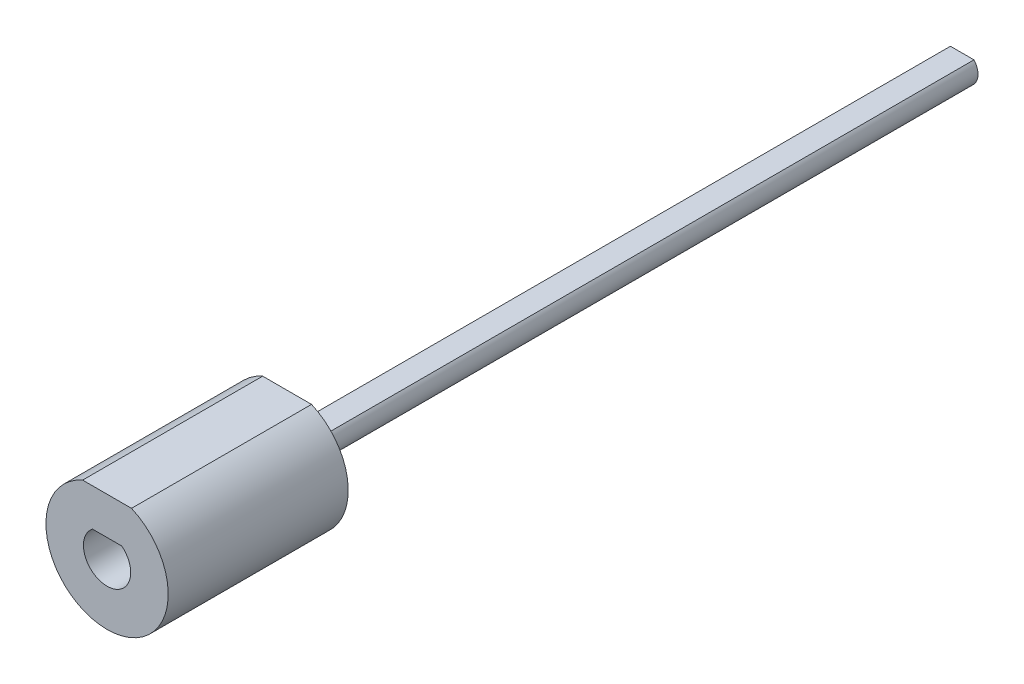
ISO-10303-21;
HEADER;
FILE_DESCRIPTION(('STEP AP214'),'2;1');
FILE_NAME('part.step','',(''),(''),'','','');
FILE_SCHEMA(('AUTOMOTIVE_DESIGN { 1 0 10303 214 1 1 1 1 }'));
ENDSEC;
DATA;
#1=APPLICATION_CONTEXT('core data for automotive mechanical design processes');
#2=APPLICATION_PROTOCOL_DEFINITION('international standard','automotive_design',2000,#1);
#3=PRODUCT_CONTEXT('',#1,'mechanical');
#4=PRODUCT('Part','Part','',(#3));
#5=PRODUCT_RELATED_PRODUCT_CATEGORY('part','',(#4));
#6=PRODUCT_DEFINITION_FORMATION('','',#4);
#7=PRODUCT_DEFINITION_CONTEXT('part definition',#1,'design');
#8=PRODUCT_DEFINITION('design','',#6,#7);
#9=PRODUCT_DEFINITION_SHAPE('','',#8);
#10=(LENGTH_UNIT() NAMED_UNIT(*) SI_UNIT(.MILLI.,.METRE.));
#11=(NAMED_UNIT(*) PLANE_ANGLE_UNIT() SI_UNIT($,.RADIAN.));
#12=(NAMED_UNIT(*) SI_UNIT($,.STERADIAN.) SOLID_ANGLE_UNIT());
#13=UNCERTAINTY_MEASURE_WITH_UNIT(LENGTH_MEASURE(1.E-05),#10,'distance_accuracy_value','');
#14=(GEOMETRIC_REPRESENTATION_CONTEXT(3) GLOBAL_UNCERTAINTY_ASSIGNED_CONTEXT((#13)) GLOBAL_UNIT_ASSIGNED_CONTEXT((#10,
#11,#12)) REPRESENTATION_CONTEXT('',''));
#15=CARTESIAN_POINT('',(0.,0.,0.));
#16=DIRECTION('',(0.,0.,1.));
#17=DIRECTION('',(1.,0.,0.));
#18=AXIS2_PLACEMENT_3D('',#15,#16,#17);
#19=CARTESIAN_POINT('',(0.,0.,-2.54));
#20=DIRECTION('',(0.,0.,-1.));
#21=DIRECTION('',(-1.,0.,0.));
#22=AXIS2_PLACEMENT_3D('',#19,#20,#21);
#23=PLANE('',#22);
#24=CARTESIAN_POINT('',(0.,0.,-2.54));
#25=DIRECTION('',(0.,0.,-1.));
#26=DIRECTION('',(-1.,0.,0.));
#27=AXIS2_PLACEMENT_3D('',#24,#25,#26);
#28=CIRCLE('',#27,1.5113);
#29=CARTESIAN_POINT('',(-1.5113,0.,-2.54));
#30=VERTEX_POINT('',#29);
#31=EDGE_CURVE('E11',#30,#30,#28,.F.);
#32=ORIENTED_EDGE('',*,*,#31,.F.);
#33=EDGE_LOOP('',(#32));
#34=FACE_BOUND('',#33,.T.);
#35=DIRECTION('',(1.,0.,0.));
#36=VECTOR('',#35,1.);
#37=CARTESIAN_POINT('',(-0.997718624440616,0.892386666666637,-2.54));
#38=LINE('',#37,#36);
#39=CARTESIAN_POINT('',(-0.997718624440616,0.892386666666637,-2.54));
#40=VERTEX_POINT('',#39);
#41=CARTESIAN_POINT('',(0.997718624440496,0.892386666666637,-2.54));
#42=VERTEX_POINT('',#41);
#43=EDGE_CURVE('E98',#40,#42,#38,.T.);
#44=ORIENTED_EDGE('',*,*,#43,.F.);
#45=CARTESIAN_POINT('',(0.,0.,-2.54));
#46=DIRECTION('',(0.,0.,-1.));
#47=DIRECTION('',(-1.,0.,0.));
#48=AXIS2_PLACEMENT_3D('',#45,#46,#47);
#49=CIRCLE('',#48,1.33858);
#50=EDGE_CURVE('E48',#42,#40,#49,.T.);
#51=ORIENTED_EDGE('',*,*,#50,.F.);
#52=EDGE_LOOP('',(#44,#51));
#53=FACE_BOUND('',#52,.T.);
#54=ADVANCED_FACE('F33',(#34,#53),#23,.T.);
#55=CARTESIAN_POINT('',(0.,0.,6.35));
#56=DIRECTION('',(0.,0.,1.));
#57=DIRECTION('',(1.,0.,0.));
#58=AXIS2_PLACEMENT_3D('',#55,#56,#57);
#59=PLANE('',#58);
#60=CARTESIAN_POINT('',(0.,0.,6.35));
#61=DIRECTION('',(0.,0.,1.));
#62=DIRECTION('',(1.,0.,0.));
#63=AXIS2_PLACEMENT_3D('',#60,#61,#62);
#64=CIRCLE('',#63,5.175);
#65=CARTESIAN_POINT('',(-2.06946310567277,4.743200128,6.35));
#66=VERTEX_POINT('',#65);
#67=CARTESIAN_POINT('',(2.06946310567277,4.743200128,6.35));
#68=VERTEX_POINT('',#67);
#69=EDGE_CURVE('E127',#66,#68,#64,.T.);
#70=ORIENTED_EDGE('',*,*,#69,.T.);
#71=DIRECTION('',(-1.,0.,0.));
#72=VECTOR('',#71,1.);
#73=CARTESIAN_POINT('',(-2.06946310567277,4.743200128,6.35));
#74=LINE('',#73,#72);
#75=EDGE_CURVE('E130',#68,#66,#74,.T.);
#76=ORIENTED_EDGE('',*,*,#75,.T.);
#77=EDGE_LOOP('',(#70,#76));
#78=FACE_BOUND('',#77,.T.);
#79=DIRECTION('',(-1.,0.,0.));
#80=VECTOR('',#79,1.);
#81=CARTESIAN_POINT('',(-1.24126885022576,1.568200128,6.35));
#82=LINE('',#81,#80);
#83=CARTESIAN_POINT('',(1.24126885022576,1.568200128,6.35));
#84=VERTEX_POINT('',#83);
#85=CARTESIAN_POINT('',(-1.24126885022576,1.568200128,6.35));
#86=VERTEX_POINT('',#85);
#87=EDGE_CURVE('E117',#84,#86,#82,.T.);
#88=ORIENTED_EDGE('',*,*,#87,.F.);
#89=CARTESIAN_POINT('',(0.,0.,6.35));
#90=DIRECTION('',(0.,0.,1.));
#91=DIRECTION('',(1.,0.,0.));
#92=AXIS2_PLACEMENT_3D('',#89,#90,#91);
#93=CIRCLE('',#92,2.);
#94=EDGE_CURVE('E115',#86,#84,#93,.T.);
#95=ORIENTED_EDGE('',*,*,#94,.F.);
#96=EDGE_LOOP('',(#88,#95));
#97=FACE_BOUND('',#96,.T.);
#98=ADVANCED_FACE('F145',(#78,#97),#59,.T.);
#99=CARTESIAN_POINT('',(0.,0.,6.35));
#100=DIRECTION('',(0.,0.,-1.));
#101=DIRECTION('',(-1.,0.,0.));
#102=AXIS2_PLACEMENT_3D('',#99,#100,#101);
#103=CYLINDRICAL_SURFACE('',#102,5.175);
#104=DIRECTION('',(0.,0.,-1.));
#105=VECTOR('',#104,1.);
#106=CARTESIAN_POINT('',(-2.06946310567277,4.743200128,6.35));
#107=LINE('',#106,#105);
#108=CARTESIAN_POINT('',(-2.06946310567277,4.743200128,-8.89));
#109=VERTEX_POINT('',#108);
#110=EDGE_CURVE('E132',#66,#109,#107,.T.);
#111=ORIENTED_EDGE('',*,*,#110,.T.);
#112=CARTESIAN_POINT('',(0.,0.,-8.89));
#113=DIRECTION('',(0.,0.,-1.));
#114=DIRECTION('',(-1.,0.,0.));
#115=AXIS2_PLACEMENT_3D('',#112,#113,#114);
#116=CIRCLE('',#115,5.175);
#117=CARTESIAN_POINT('',(2.06946310567277,4.743200128,-8.89));
#118=VERTEX_POINT('',#117);
#119=EDGE_CURVE('E104',#118,#109,#116,.T.);
#120=ORIENTED_EDGE('',*,*,#119,.F.);
#121=DIRECTION('',(0.,0.,-1.));
#122=VECTOR('',#121,1.);
#123=CARTESIAN_POINT('',(2.06946310567277,4.743200128,6.35));
#124=LINE('',#123,#122);
#125=EDGE_CURVE('E41',#68,#118,#124,.T.);
#126=ORIENTED_EDGE('',*,*,#125,.F.);
#127=ORIENTED_EDGE('',*,*,#69,.F.);
#128=EDGE_LOOP('',(#111,#120,#126,#127));
#129=FACE_BOUND('',#128,.T.);
#130=ADVANCED_FACE('F35',(#129),#103,.T.);
#131=CARTESIAN_POINT('',(-2.06946310567277,4.743200128,6.35));
#132=DIRECTION('',(0.,-1.,0.));
#133=DIRECTION('',(0.,0.,-1.));
#134=AXIS2_PLACEMENT_3D('',#131,#132,#133);
#135=PLANE('',#134);
#136=ORIENTED_EDGE('',*,*,#125,.T.);
#137=DIRECTION('',(1.,0.,0.));
#138=VECTOR('',#137,1.);
#139=CARTESIAN_POINT('',(-2.06946310567277,4.743200128,-8.89));
#140=LINE('',#139,#138);
#141=EDGE_CURVE('E111',#109,#118,#140,.T.);
#142=ORIENTED_EDGE('',*,*,#141,.F.);
#143=ORIENTED_EDGE('',*,*,#110,.F.);
#144=ORIENTED_EDGE('',*,*,#75,.F.);
#145=EDGE_LOOP('',(#136,#142,#143,#144));
#146=FACE_BOUND('',#145,.T.);
#147=ADVANCED_FACE('F136',(#146),#135,.F.);
#148=CARTESIAN_POINT('',(0.,0.,6.35));
#149=DIRECTION('',(0.,0.,-1.));
#150=DIRECTION('',(-1.,0.,0.));
#151=AXIS2_PLACEMENT_3D('',#148,#149,#150);
#152=CYLINDRICAL_SURFACE('',#151,2.);
#153=CARTESIAN_POINT('',(0.,0.,0.));
#154=DIRECTION('',(0.,0.,1.));
#155=DIRECTION('',(1.,0.,0.));
#156=AXIS2_PLACEMENT_3D('',#153,#154,#155);
#157=CIRCLE('',#156,2.);
#158=CARTESIAN_POINT('',(-1.24126885022576,1.568200128,0.));
#159=VERTEX_POINT('',#158);
#160=CARTESIAN_POINT('',(1.24126885022576,1.568200128,0.));
#161=VERTEX_POINT('',#160);
#162=EDGE_CURVE('E114',#159,#161,#157,.T.);
#163=ORIENTED_EDGE('',*,*,#162,.F.);
#164=DIRECTION('',(0.,0.,-1.));
#165=VECTOR('',#164,1.);
#166=CARTESIAN_POINT('',(-1.24126885022576,1.568200128,6.35));
#167=LINE('',#166,#165);
#168=EDGE_CURVE('E120',#86,#159,#167,.T.);
#169=ORIENTED_EDGE('',*,*,#168,.F.);
#170=ORIENTED_EDGE('',*,*,#94,.T.);
#171=DIRECTION('',(0.,0.,-1.));
#172=VECTOR('',#171,1.);
#173=CARTESIAN_POINT('',(1.24126885022576,1.568200128,6.35));
#174=LINE('',#173,#172);
#175=EDGE_CURVE('E56',#84,#161,#174,.T.);
#176=ORIENTED_EDGE('',*,*,#175,.T.);
#177=EDGE_LOOP('',(#163,#169,#170,#176));
#178=FACE_BOUND('',#177,.T.);
#179=ADVANCED_FACE('F155',(#178),#152,.F.);
#180=CARTESIAN_POINT('',(-1.24126885022576,1.568200128,6.35));
#181=DIRECTION('',(0.,-1.,0.));
#182=DIRECTION('',(0.,0.,-1.));
#183=AXIS2_PLACEMENT_3D('',#180,#181,#182);
#184=PLANE('',#183);
#185=DIRECTION('',(-1.,0.,0.));
#186=VECTOR('',#185,1.);
#187=CARTESIAN_POINT('',(-1.24126885022576,1.568200128,0.));
#188=LINE('',#187,#186);
#189=EDGE_CURVE('E118',#161,#159,#188,.T.);
#190=ORIENTED_EDGE('',*,*,#189,.F.);
#191=ORIENTED_EDGE('',*,*,#175,.F.);
#192=ORIENTED_EDGE('',*,*,#87,.T.);
#193=ORIENTED_EDGE('',*,*,#168,.T.);
#194=EDGE_LOOP('',(#190,#191,#192,#193));
#195=FACE_BOUND('',#194,.T.);
#196=ADVANCED_FACE('F152',(#195),#184,.T.);
#197=CARTESIAN_POINT('',(0.,0.,0.));
#198=DIRECTION('',(0.,0.,-1.));
#199=DIRECTION('',(-1.,0.,0.));
#200=AXIS2_PLACEMENT_3D('',#197,#198,#199);
#201=PLANE('',#200);
#202=ORIENTED_EDGE('',*,*,#189,.T.);
#203=ORIENTED_EDGE('',*,*,#162,.T.);
#204=EDGE_LOOP('',(#202,#203));
#205=FACE_BOUND('',#204,.T.);
#206=ADVANCED_FACE('F157',(#205),#201,.F.);
#207=CARTESIAN_POINT('',(0.,0.,-8.89));
#208=DIRECTION('',(0.,0.,-1.));
#209=DIRECTION('',(-1.,0.,0.));
#210=AXIS2_PLACEMENT_3D('',#207,#208,#209);
#211=PLANE('',#210);
#212=ORIENTED_EDGE('',*,*,#119,.T.);
#213=ORIENTED_EDGE('',*,*,#141,.T.);
#214=EDGE_LOOP('',(#212,#213));
#215=FACE_BOUND('',#214,.T.);
#216=CARTESIAN_POINT('',(0.,0.,-8.89));
#217=DIRECTION('',(0.,0.,-1.));
#218=DIRECTION('',(-1.,0.,0.));
#219=AXIS2_PLACEMENT_3D('',#216,#217,#218);
#220=CIRCLE('',#219,1.5113);
#221=CARTESIAN_POINT('',(-1.5113,0.,-8.89));
#222=VERTEX_POINT('',#221);
#223=EDGE_CURVE('E101',#222,#222,#220,.T.);
#224=ORIENTED_EDGE('',*,*,#223,.F.);
#225=EDGE_LOOP('',(#224));
#226=FACE_BOUND('',#225,.T.);
#227=ADVANCED_FACE('F142',(#215,#226),#211,.T.);
#228=CARTESIAN_POINT('',(0.,0.,-8.89));
#229=DIRECTION('',(0.,0.,1.));
#230=DIRECTION('',(1.,0.,0.));
#231=AXIS2_PLACEMENT_3D('',#228,#229,#230);
#232=CYLINDRICAL_SURFACE('',#231,1.5113);
#233=ORIENTED_EDGE('',*,*,#223,.T.);
#234=EDGE_LOOP('',(#233));
#235=FACE_BOUND('',#234,.T.);
#236=ORIENTED_EDGE('',*,*,#31,.T.);
#237=EDGE_LOOP('',(#236));
#238=FACE_BOUND('',#237,.T.);
#239=ADVANCED_FACE('F164',(#235,#238),#232,.F.);
#240=CARTESIAN_POINT('',(0.,0.,-66.04));
#241=DIRECTION('',(0.,0.,1.));
#242=DIRECTION('',(1.,0.,0.));
#243=AXIS2_PLACEMENT_3D('',#240,#241,#242);
#244=CYLINDRICAL_SURFACE('',#243,1.33858);
#245=ORIENTED_EDGE('',*,*,#50,.T.);
#246=DIRECTION('',(0.,0.,1.));
#247=VECTOR('',#246,1.);
#248=CARTESIAN_POINT('',(-0.997718624440616,0.892386666666637,-66.04));
#249=LINE('',#248,#247);
#250=CARTESIAN_POINT('',(-0.997718624440616,0.892386666666637,-66.04));
#251=VERTEX_POINT('',#250);
#252=EDGE_CURVE('E90',#251,#40,#249,.T.);
#253=ORIENTED_EDGE('',*,*,#252,.F.);
#254=CARTESIAN_POINT('',(0.,0.,-66.04));
#255=DIRECTION('',(0.,0.,-1.));
#256=DIRECTION('',(-1.,0.,0.));
#257=AXIS2_PLACEMENT_3D('',#254,#255,#256);
#258=CIRCLE('',#257,1.33858);
#259=CARTESIAN_POINT('',(0.997718624440496,0.892386666666637,-66.04));
#260=VERTEX_POINT('',#259);
#261=EDGE_CURVE('E95',#260,#251,#258,.T.);
#262=ORIENTED_EDGE('',*,*,#261,.F.);
#263=DIRECTION('',(0.,0.,1.));
#264=VECTOR('',#263,1.);
#265=CARTESIAN_POINT('',(0.997718624440496,0.892386666666637,-66.04));
#266=LINE('',#265,#264);
#267=EDGE_CURVE('E92',#260,#42,#266,.T.);
#268=ORIENTED_EDGE('',*,*,#267,.T.);
#269=EDGE_LOOP('',(#245,#253,#262,#268));
#270=FACE_BOUND('',#269,.T.);
#271=ADVANCED_FACE('F100',(#270),#244,.T.);
#272=CARTESIAN_POINT('',(-0.997718624440616,0.892386666666637,-66.04));
#273=DIRECTION('',(0.,-1.,0.));
#274=DIRECTION('',(0.,0.,-1.));
#275=AXIS2_PLACEMENT_3D('',#272,#273,#274);
#276=PLANE('',#275);
#277=ORIENTED_EDGE('',*,*,#43,.T.);
#278=ORIENTED_EDGE('',*,*,#267,.F.);
#279=DIRECTION('',(1.,0.,0.));
#280=VECTOR('',#279,1.);
#281=CARTESIAN_POINT('',(-0.997718624440616,0.892386666666637,-66.04));
#282=LINE('',#281,#280);
#283=EDGE_CURVE('E87',#251,#260,#282,.T.);
#284=ORIENTED_EDGE('',*,*,#283,.F.);
#285=ORIENTED_EDGE('',*,*,#252,.T.);
#286=EDGE_LOOP('',(#277,#278,#284,#285));
#287=FACE_BOUND('',#286,.T.);
#288=ADVANCED_FACE('F89',(#287),#276,.F.);
#289=CARTESIAN_POINT('',(0.,0.,-66.04));
#290=DIRECTION('',(0.,0.,-1.));
#291=DIRECTION('',(-1.,0.,0.));
#292=AXIS2_PLACEMENT_3D('',#289,#290,#291);
#293=PLANE('',#292);
#294=ORIENTED_EDGE('',*,*,#261,.T.);
#295=ORIENTED_EDGE('',*,*,#283,.T.);
#296=EDGE_LOOP('',(#294,#295));
#297=FACE_BOUND('',#296,.T.);
#298=ADVANCED_FACE('F97',(#297),#293,.T.);
#299=CLOSED_SHELL('',(#54,#98,#130,#147,#179,#196,#206,#227,#239,#271,#288,#298));
#300=MANIFOLD_SOLID_BREP('B2',#299);
#301=ADVANCED_BREP_SHAPE_REPRESENTATION('',(#18,#300),#14);
#302=SHAPE_DEFINITION_REPRESENTATION(#9,#301);
ENDSEC;
END-ISO-10303-21;
